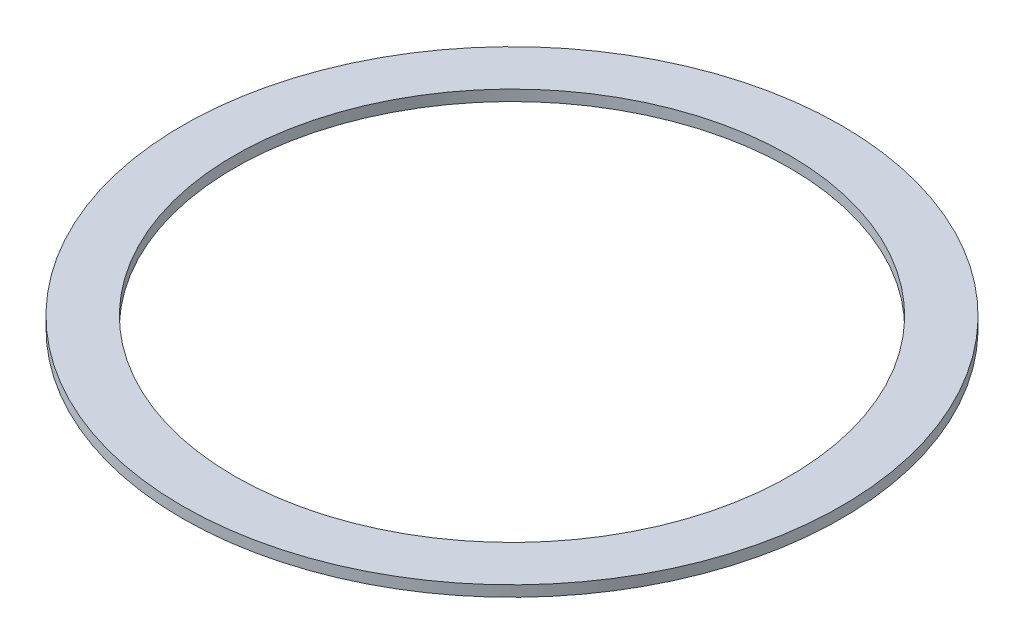
ISO-10303-21;
HEADER;
FILE_DESCRIPTION(('STEP AP214'),'2;1');
FILE_NAME('part.step','',(''),(''),'','','');
FILE_SCHEMA(('AUTOMOTIVE_DESIGN { 1 0 10303 214 1 1 1 1 }'));
ENDSEC;
DATA;
#1=APPLICATION_CONTEXT('core data for automotive mechanical design processes');
#2=APPLICATION_PROTOCOL_DEFINITION('international standard','automotive_design',2000,#1);
#3=PRODUCT_CONTEXT('',#1,'mechanical');
#4=PRODUCT('Part','Part','',(#3));
#5=PRODUCT_RELATED_PRODUCT_CATEGORY('part','',(#4));
#6=PRODUCT_DEFINITION_FORMATION('','',#4);
#7=PRODUCT_DEFINITION_CONTEXT('part definition',#1,'design');
#8=PRODUCT_DEFINITION('design','',#6,#7);
#9=PRODUCT_DEFINITION_SHAPE('','',#8);
#10=(LENGTH_UNIT() NAMED_UNIT(*) SI_UNIT(.MILLI.,.METRE.));
#11=(NAMED_UNIT(*) PLANE_ANGLE_UNIT() SI_UNIT($,.RADIAN.));
#12=(NAMED_UNIT(*) SI_UNIT($,.STERADIAN.) SOLID_ANGLE_UNIT());
#13=UNCERTAINTY_MEASURE_WITH_UNIT(LENGTH_MEASURE(1.E-05),#10,'distance_accuracy_value','');
#14=(GEOMETRIC_REPRESENTATION_CONTEXT(3) GLOBAL_UNCERTAINTY_ASSIGNED_CONTEXT((#13)) GLOBAL_UNIT_ASSIGNED_CONTEXT((#10,
#11,#12)) REPRESENTATION_CONTEXT('',''));
#15=CARTESIAN_POINT('',(0.,0.,0.));
#16=DIRECTION('',(0.,0.,1.));
#17=DIRECTION('',(1.,0.,0.));
#18=AXIS2_PLACEMENT_3D('',#15,#16,#17);
#19=CARTESIAN_POINT('',(0.,2.5,0.));
#20=DIRECTION('',(0.,1.,0.));
#21=DIRECTION('',(0.,0.,1.));
#22=AXIS2_PLACEMENT_3D('',#19,#20,#21);
#23=PLANE('',#22);
#24=CARTESIAN_POINT('',(0.,2.5,0.));
#25=DIRECTION('',(0.,1.,0.));
#26=DIRECTION('',(0.,0.,1.));
#27=AXIS2_PLACEMENT_3D('',#24,#25,#26);
#28=CIRCLE('',#27,76.2);
#29=CARTESIAN_POINT('',(0.,2.5,76.2));
#30=VERTEX_POINT('',#29);
#31=EDGE_CURVE('E10',#30,#30,#28,.T.);
#32=ORIENTED_EDGE('',*,*,#31,.T.);
#33=EDGE_LOOP('',(#32));
#34=FACE_BOUND('',#33,.T.);
#35=CARTESIAN_POINT('',(0.,2.5,0.));
#36=DIRECTION('',(0.,1.,0.));
#37=DIRECTION('',(0.,0.,1.));
#38=AXIS2_PLACEMENT_3D('',#35,#36,#37);
#39=CIRCLE('',#38,64.2);
#40=CARTESIAN_POINT('',(0.,2.5,64.2));
#41=VERTEX_POINT('',#40);
#42=EDGE_CURVE('E50',#41,#41,#39,.T.);
#43=ORIENTED_EDGE('',*,*,#42,.F.);
#44=EDGE_LOOP('',(#43));
#45=FACE_BOUND('',#44,.T.);
#46=ADVANCED_FACE('F37',(#34,#45),#23,.T.);
#47=CARTESIAN_POINT('',(0.,0.,0.));
#48=DIRECTION('',(0.,1.,0.));
#49=DIRECTION('',(0.,0.,1.));
#50=AXIS2_PLACEMENT_3D('',#47,#48,#49);
#51=PLANE('',#50);
#52=CARTESIAN_POINT('',(0.,0.,0.));
#53=DIRECTION('',(0.,1.,0.));
#54=DIRECTION('',(0.,0.,1.));
#55=AXIS2_PLACEMENT_3D('',#52,#53,#54);
#56=CIRCLE('',#55,76.2);
#57=CARTESIAN_POINT('',(0.,0.,76.2));
#58=VERTEX_POINT('',#57);
#59=EDGE_CURVE('E41',#58,#58,#56,.T.);
#60=ORIENTED_EDGE('',*,*,#59,.F.);
#61=EDGE_LOOP('',(#60));
#62=FACE_BOUND('',#61,.T.);
#63=CARTESIAN_POINT('',(0.,0.,0.));
#64=DIRECTION('',(0.,1.,0.));
#65=DIRECTION('',(0.,0.,1.));
#66=AXIS2_PLACEMENT_3D('',#63,#64,#65);
#67=CIRCLE('',#66,64.2);
#68=CARTESIAN_POINT('',(0.,0.,64.2));
#69=VERTEX_POINT('',#68);
#70=EDGE_CURVE('E52',#69,#69,#67,.T.);
#71=ORIENTED_EDGE('',*,*,#70,.T.);
#72=EDGE_LOOP('',(#71));
#73=FACE_BOUND('',#72,.T.);
#74=ADVANCED_FACE('F64',(#62,#73),#51,.F.);
#75=CARTESIAN_POINT('',(0.,2.5,0.));
#76=DIRECTION('',(0.,-1.,0.));
#77=DIRECTION('',(0.,0.,-1.));
#78=AXIS2_PLACEMENT_3D('',#75,#76,#77);
#79=CYLINDRICAL_SURFACE('',#78,76.2);
#80=ORIENTED_EDGE('',*,*,#31,.F.);
#81=EDGE_LOOP('',(#80));
#82=FACE_BOUND('',#81,.T.);
#83=ORIENTED_EDGE('',*,*,#59,.T.);
#84=EDGE_LOOP('',(#83));
#85=FACE_BOUND('',#84,.T.);
#86=ADVANCED_FACE('F39',(#82,#85),#79,.T.);
#87=CARTESIAN_POINT('',(0.,2.5,0.));
#88=DIRECTION('',(0.,-1.,0.));
#89=DIRECTION('',(0.,0.,-1.));
#90=AXIS2_PLACEMENT_3D('',#87,#88,#89);
#91=CYLINDRICAL_SURFACE('',#90,64.2);
#92=ORIENTED_EDGE('',*,*,#42,.T.);
#93=EDGE_LOOP('',(#92));
#94=FACE_BOUND('',#93,.T.);
#95=ORIENTED_EDGE('',*,*,#70,.F.);
#96=EDGE_LOOP('',(#95));
#97=FACE_BOUND('',#96,.T.);
#98=ADVANCED_FACE('F60',(#94,#97),#91,.F.);
#99=CLOSED_SHELL('',(#46,#74,#86,#98));
#100=MANIFOLD_SOLID_BREP('B2',#99);
#101=ADVANCED_BREP_SHAPE_REPRESENTATION('',(#18,#100),#14);
#102=SHAPE_DEFINITION_REPRESENTATION(#9,#101);
ENDSEC;
END-ISO-10303-21;
